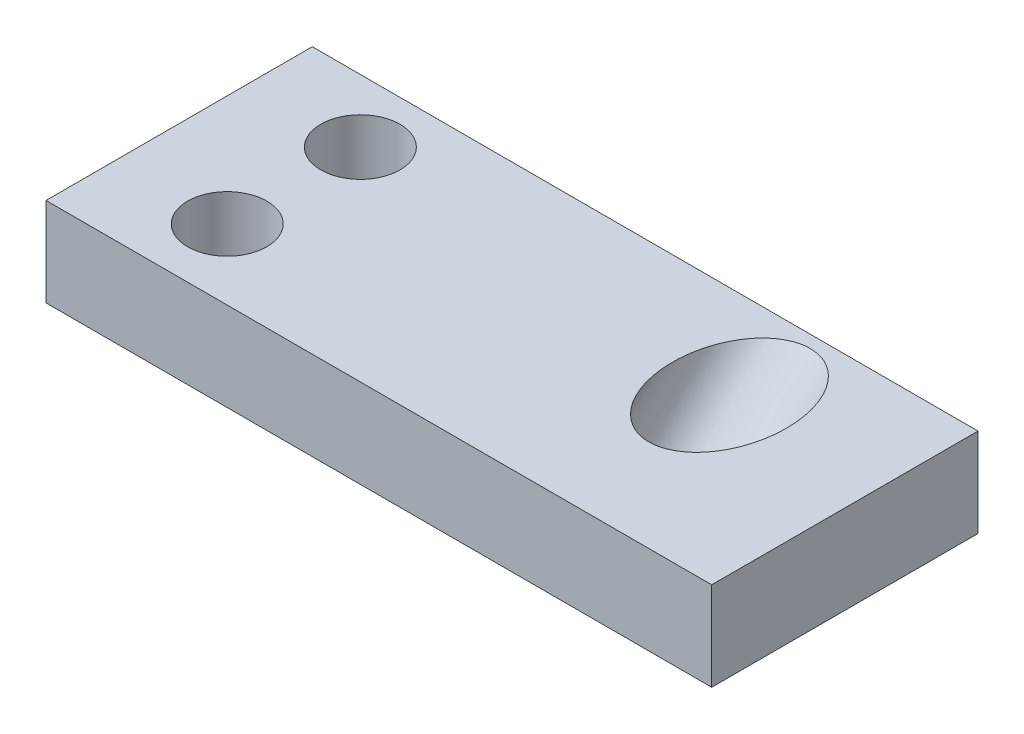
ISO-10303-21;
HEADER;
FILE_DESCRIPTION(('STEP AP214'),'2;1');
FILE_NAME('part.step','',(''),(''),'','','');
FILE_SCHEMA(('AUTOMOTIVE_DESIGN { 1 0 10303 214 1 1 1 1 }'));
ENDSEC;
DATA;
#1=APPLICATION_CONTEXT('core data for automotive mechanical design processes');
#2=APPLICATION_PROTOCOL_DEFINITION('international standard','automotive_design',2000,#1);
#3=PRODUCT_CONTEXT('',#1,'mechanical');
#4=PRODUCT('Part','Part','',(#3));
#5=PRODUCT_RELATED_PRODUCT_CATEGORY('part','',(#4));
#6=PRODUCT_DEFINITION_FORMATION('','',#4);
#7=PRODUCT_DEFINITION_CONTEXT('part definition',#1,'design');
#8=PRODUCT_DEFINITION('design','',#6,#7);
#9=PRODUCT_DEFINITION_SHAPE('','',#8);
#10=(LENGTH_UNIT() NAMED_UNIT(*) SI_UNIT(.MILLI.,.METRE.));
#11=(NAMED_UNIT(*) PLANE_ANGLE_UNIT() SI_UNIT($,.RADIAN.));
#12=(NAMED_UNIT(*) SI_UNIT($,.STERADIAN.) SOLID_ANGLE_UNIT());
#13=UNCERTAINTY_MEASURE_WITH_UNIT(LENGTH_MEASURE(1.E-05),#10,'distance_accuracy_value','');
#14=(GEOMETRIC_REPRESENTATION_CONTEXT(3) GLOBAL_UNCERTAINTY_ASSIGNED_CONTEXT((#13)) GLOBAL_UNIT_ASSIGNED_CONTEXT((#10,
#11,#12)) REPRESENTATION_CONTEXT('',''));
#15=CARTESIAN_POINT('',(0.,0.,0.));
#16=DIRECTION('',(0.,0.,1.));
#17=DIRECTION('',(1.,0.,0.));
#18=AXIS2_PLACEMENT_3D('',#15,#16,#17);
#19=CARTESIAN_POINT('',(0.,4.,0.));
#20=DIRECTION('',(0.,1.,0.));
#21=DIRECTION('',(0.,0.,1.));
#22=AXIS2_PLACEMENT_3D('',#19,#20,#21);
#23=PLANE('',#22);
#24=CARTESIAN_POINT('',(8.00000000000001,4.,-1.79999999999999));
#25=DIRECTION('',(0.,1.,0.));
#26=DIRECTION('',(0.,0.,1.));
#27=AXIS2_PLACEMENT_3D('',#24,#25,#26);
#28=ELLIPSE('',#27,3.6415999231107,2.575);
#29=CARTESIAN_POINT('',(8.00000000000001,4.,1.84159992311071));
#30=VERTEX_POINT('',#29);
#31=EDGE_CURVE('E125',#30,#30,#28,.T.);
#32=ORIENTED_EDGE('',*,*,#31,.F.);
#33=EDGE_LOOP('',(#32));
#34=FACE_BOUND('',#33,.T.);
#35=CARTESIAN_POINT('',(-9.99999999999999,4.,-3.16656909393444));
#36=DIRECTION('',(0.,1.,0.));
#37=DIRECTION('',(0.,0.,1.));
#38=AXIS2_PLACEMENT_3D('',#35,#36,#37);
#39=CIRCLE('',#38,1.78502343525045);
#40=CARTESIAN_POINT('',(-9.99999999999999,4.,-1.381545658684));
#41=VERTEX_POINT('',#40);
#42=EDGE_CURVE('E104',#41,#41,#39,.T.);
#43=ORIENTED_EDGE('',*,*,#42,.F.);
#44=EDGE_LOOP('',(#43));
#45=FACE_BOUND('',#44,.T.);
#46=DIRECTION('',(0.,0.,-1.));
#47=VECTOR('',#46,1.);
#48=CARTESIAN_POINT('',(15.,4.,-5.99999999999999));
#49=LINE('',#48,#47);
#50=CARTESIAN_POINT('',(15.,4.,6.00000000000001));
#51=VERTEX_POINT('',#50);
#52=CARTESIAN_POINT('',(15.,4.,-5.99999999999999));
#53=VERTEX_POINT('',#52);
#54=EDGE_CURVE('E88',#51,#53,#49,.T.);
#55=ORIENTED_EDGE('',*,*,#54,.T.);
#56=DIRECTION('',(-1.,0.,0.));
#57=VECTOR('',#56,1.);
#58=CARTESIAN_POINT('',(-15.,4.,-5.99999999999999));
#59=LINE('',#58,#57);
#60=CARTESIAN_POINT('',(-15.,4.,-5.99999999999999));
#61=VERTEX_POINT('',#60);
#62=EDGE_CURVE('E83',#53,#61,#59,.T.);
#63=ORIENTED_EDGE('',*,*,#62,.T.);
#64=DIRECTION('',(0.,0.,1.));
#65=VECTOR('',#64,1.);
#66=CARTESIAN_POINT('',(-15.,4.,-5.99999999999999));
#67=LINE('',#66,#65);
#68=CARTESIAN_POINT('',(-15.,4.,6.00000000000001));
#69=VERTEX_POINT('',#68);
#70=EDGE_CURVE('E86',#61,#69,#67,.T.);
#71=ORIENTED_EDGE('',*,*,#70,.T.);
#72=DIRECTION('',(1.,0.,0.));
#73=VECTOR('',#72,1.);
#74=CARTESIAN_POINT('',(-15.,4.,6.00000000000001));
#75=LINE('',#74,#73);
#76=EDGE_CURVE('E53',#69,#51,#75,.T.);
#77=ORIENTED_EDGE('',*,*,#76,.T.);
#78=EDGE_LOOP('',(#55,#63,#71,#77));
#79=FACE_BOUND('',#78,.T.);
#80=CARTESIAN_POINT('',(-9.99999999999999,4.,2.83343090606556));
#81=DIRECTION('',(0.,1.,0.));
#82=DIRECTION('',(0.,0.,1.));
#83=AXIS2_PLACEMENT_3D('',#80,#81,#82);
#84=CIRCLE('',#83,1.78502343525045);
#85=CARTESIAN_POINT('',(-9.99999999999999,4.,4.618454341316));
#86=VERTEX_POINT('',#85);
#87=EDGE_CURVE('E119',#86,#86,#84,.T.);
#88=ORIENTED_EDGE('',*,*,#87,.F.);
#89=EDGE_LOOP('',(#88));
#90=FACE_BOUND('',#89,.T.);
#91=ADVANCED_FACE('F35',(#34,#45,#79,#90),#23,.T.);
#92=CARTESIAN_POINT('',(0.,0.,0.));
#93=DIRECTION('',(0.,1.,0.));
#94=DIRECTION('',(0.,0.,1.));
#95=AXIS2_PLACEMENT_3D('',#92,#93,#94);
#96=PLANE('',#95);
#97=CARTESIAN_POINT('',(8.00000000000001,0.,2.19999999999997));
#98=DIRECTION('',(0.,1.,0.));
#99=DIRECTION('',(0.,0.,1.));
#100=AXIS2_PLACEMENT_3D('',#97,#98,#99);
#101=ELLIPSE('',#100,3.6415999231107,2.575);
#102=CARTESIAN_POINT('',(8.00000000000001,0.,5.84159992311067));
#103=VERTEX_POINT('',#102);
#104=EDGE_CURVE('E39',#103,#103,#101,.T.);
#105=ORIENTED_EDGE('',*,*,#104,.T.);
#106=EDGE_LOOP('',(#105));
#107=FACE_BOUND('',#106,.T.);
#108=CARTESIAN_POINT('',(-9.99999999999999,0.,-3.16656909393444));
#109=DIRECTION('',(0.,1.,0.));
#110=DIRECTION('',(0.,0.,1.));
#111=AXIS2_PLACEMENT_3D('',#108,#109,#110);
#112=CIRCLE('',#111,1.78502343525045);
#113=CARTESIAN_POINT('',(-9.99999999999999,0.,-1.381545658684));
#114=VERTEX_POINT('',#113);
#115=EDGE_CURVE('E116',#114,#114,#112,.T.);
#116=ORIENTED_EDGE('',*,*,#115,.T.);
#117=EDGE_LOOP('',(#116));
#118=FACE_BOUND('',#117,.T.);
#119=DIRECTION('',(0.,0.,-1.));
#120=VECTOR('',#119,1.);
#121=CARTESIAN_POINT('',(15.,0.,-5.99999999999999));
#122=LINE('',#121,#120);
#123=CARTESIAN_POINT('',(15.,0.,6.00000000000001));
#124=VERTEX_POINT('',#123);
#125=CARTESIAN_POINT('',(15.,0.,-5.99999999999999));
#126=VERTEX_POINT('',#125);
#127=EDGE_CURVE('E101',#124,#126,#122,.T.);
#128=ORIENTED_EDGE('',*,*,#127,.F.);
#129=DIRECTION('',(1.,0.,0.));
#130=VECTOR('',#129,1.);
#131=CARTESIAN_POINT('',(-15.,0.,6.00000000000001));
#132=LINE('',#131,#130);
#133=CARTESIAN_POINT('',(-15.,0.,6.00000000000001));
#134=VERTEX_POINT('',#133);
#135=EDGE_CURVE('E76',#134,#124,#132,.T.);
#136=ORIENTED_EDGE('',*,*,#135,.F.);
#137=DIRECTION('',(0.,0.,1.));
#138=VECTOR('',#137,1.);
#139=CARTESIAN_POINT('',(-15.,0.,-5.99999999999999));
#140=LINE('',#139,#138);
#141=CARTESIAN_POINT('',(-15.,0.,-5.99999999999999));
#142=VERTEX_POINT('',#141);
#143=EDGE_CURVE('E70',#142,#134,#140,.T.);
#144=ORIENTED_EDGE('',*,*,#143,.F.);
#145=DIRECTION('',(-1.,0.,0.));
#146=VECTOR('',#145,1.);
#147=CARTESIAN_POINT('',(-15.,0.,-5.99999999999999));
#148=LINE('',#147,#146);
#149=EDGE_CURVE('E92',#126,#142,#148,.T.);
#150=ORIENTED_EDGE('',*,*,#149,.F.);
#151=EDGE_LOOP('',(#128,#136,#144,#150));
#152=FACE_BOUND('',#151,.T.);
#153=CARTESIAN_POINT('',(-9.99999999999999,0.,2.83343090606556));
#154=DIRECTION('',(0.,1.,0.));
#155=DIRECTION('',(0.,0.,1.));
#156=AXIS2_PLACEMENT_3D('',#153,#154,#155);
#157=CIRCLE('',#156,1.78502343525045);
#158=CARTESIAN_POINT('',(-9.99999999999999,0.,4.618454341316));
#159=VERTEX_POINT('',#158);
#160=EDGE_CURVE('E122',#159,#159,#157,.T.);
#161=ORIENTED_EDGE('',*,*,#160,.T.);
#162=EDGE_LOOP('',(#161));
#163=FACE_BOUND('',#162,.T.);
#164=ADVANCED_FACE('F112',(#107,#118,#152,#163),#96,.F.);
#165=CARTESIAN_POINT('',(15.,4.,-5.99999999999999));
#166=DIRECTION('',(-1.,0.,0.));
#167=DIRECTION('',(0.,0.,1.));
#168=AXIS2_PLACEMENT_3D('',#165,#166,#167);
#169=PLANE('',#168);
#170=ORIENTED_EDGE('',*,*,#127,.T.);
#171=DIRECTION('',(0.,-1.,0.));
#172=VECTOR('',#171,1.);
#173=CARTESIAN_POINT('',(15.,4.,-5.99999999999999));
#174=LINE('',#173,#172);
#175=EDGE_CURVE('E11',#53,#126,#174,.T.);
#176=ORIENTED_EDGE('',*,*,#175,.F.);
#177=ORIENTED_EDGE('',*,*,#54,.F.);
#178=DIRECTION('',(0.,-1.,0.));
#179=VECTOR('',#178,1.);
#180=CARTESIAN_POINT('',(15.,4.,6.00000000000001));
#181=LINE('',#180,#179);
#182=EDGE_CURVE('E97',#51,#124,#181,.T.);
#183=ORIENTED_EDGE('',*,*,#182,.T.);
#184=EDGE_LOOP('',(#170,#176,#177,#183));
#185=FACE_BOUND('',#184,.T.);
#186=ADVANCED_FACE('F37',(#185),#169,.F.);
#187=CARTESIAN_POINT('',(-15.,4.,-5.99999999999999));
#188=DIRECTION('',(0.,0.,1.));
#189=DIRECTION('',(1.,0.,0.));
#190=AXIS2_PLACEMENT_3D('',#187,#188,#189);
#191=PLANE('',#190);
#192=ORIENTED_EDGE('',*,*,#149,.T.);
#193=DIRECTION('',(0.,-1.,0.));
#194=VECTOR('',#193,1.);
#195=CARTESIAN_POINT('',(-15.,4.,-5.99999999999999));
#196=LINE('',#195,#194);
#197=EDGE_CURVE('E45',#61,#142,#196,.T.);
#198=ORIENTED_EDGE('',*,*,#197,.F.);
#199=ORIENTED_EDGE('',*,*,#62,.F.);
#200=ORIENTED_EDGE('',*,*,#175,.T.);
#201=EDGE_LOOP('',(#192,#198,#199,#200));
#202=FACE_BOUND('',#201,.T.);
#203=ADVANCED_FACE('F91',(#202),#191,.F.);
#204=CARTESIAN_POINT('',(-15.,4.,-5.99999999999999));
#205=DIRECTION('',(1.,0.,0.));
#206=DIRECTION('',(0.,0.,-1.));
#207=AXIS2_PLACEMENT_3D('',#204,#205,#206);
#208=PLANE('',#207);
#209=ORIENTED_EDGE('',*,*,#143,.T.);
#210=DIRECTION('',(0.,-1.,0.));
#211=VECTOR('',#210,1.);
#212=CARTESIAN_POINT('',(-15.,4.,6.00000000000001));
#213=LINE('',#212,#211);
#214=EDGE_CURVE('E93',#69,#134,#213,.T.);
#215=ORIENTED_EDGE('',*,*,#214,.F.);
#216=ORIENTED_EDGE('',*,*,#70,.F.);
#217=ORIENTED_EDGE('',*,*,#197,.T.);
#218=EDGE_LOOP('',(#209,#215,#216,#217));
#219=FACE_BOUND('',#218,.T.);
#220=ADVANCED_FACE('F95',(#219),#208,.F.);
#221=CARTESIAN_POINT('',(-15.,4.,6.00000000000001));
#222=DIRECTION('',(0.,0.,-1.));
#223=DIRECTION('',(-1.,0.,0.));
#224=AXIS2_PLACEMENT_3D('',#221,#222,#223);
#225=PLANE('',#224);
#226=ORIENTED_EDGE('',*,*,#135,.T.);
#227=ORIENTED_EDGE('',*,*,#182,.F.);
#228=ORIENTED_EDGE('',*,*,#76,.F.);
#229=ORIENTED_EDGE('',*,*,#214,.T.);
#230=EDGE_LOOP('',(#226,#227,#228,#229));
#231=FACE_BOUND('',#230,.T.);
#232=ADVANCED_FACE('F109',(#231),#225,.F.);
#233=CARTESIAN_POINT('',(-9.99999999999999,4.,-3.16656909393444));
#234=DIRECTION('',(0.,-1.,0.));
#235=DIRECTION('',(0.,0.,-1.));
#236=AXIS2_PLACEMENT_3D('',#233,#234,#235);
#237=CYLINDRICAL_SURFACE('',#236,1.78502343525045);
#238=ORIENTED_EDGE('',*,*,#42,.T.);
#239=EDGE_LOOP('',(#238));
#240=FACE_BOUND('',#239,.T.);
#241=ORIENTED_EDGE('',*,*,#115,.F.);
#242=EDGE_LOOP('',(#241));
#243=FACE_BOUND('',#242,.T.);
#244=ADVANCED_FACE('F143',(#240,#243),#237,.F.);
#245=CARTESIAN_POINT('',(-9.99999999999999,4.,2.83343090606556));
#246=DIRECTION('',(0.,-1.,0.));
#247=DIRECTION('',(0.,0.,-1.));
#248=AXIS2_PLACEMENT_3D('',#245,#246,#247);
#249=CYLINDRICAL_SURFACE('',#248,1.78502343525045);
#250=ORIENTED_EDGE('',*,*,#87,.T.);
#251=EDGE_LOOP('',(#250));
#252=FACE_BOUND('',#251,.T.);
#253=ORIENTED_EDGE('',*,*,#160,.F.);
#254=EDGE_LOOP('',(#253));
#255=FACE_BOUND('',#254,.T.);
#256=ADVANCED_FACE('F138',(#252,#255),#249,.F.);
#257=CARTESIAN_POINT('',(8.00000000000001,21.6776695296638,-19.4776695296636));
#258=DIRECTION('',(0.,-0.707106781186551,0.707106781186544));
#259=DIRECTION('',(0.,-0.707106781186544,-0.707106781186551));
#260=AXIS2_PLACEMENT_3D('',#257,#258,#259);
#261=CYLINDRICAL_SURFACE('',#260,2.575);
#262=ORIENTED_EDGE('',*,*,#31,.T.);
#263=EDGE_LOOP('',(#262));
#264=FACE_BOUND('',#263,.T.);
#265=ORIENTED_EDGE('',*,*,#104,.F.);
#266=EDGE_LOOP('',(#265));
#267=FACE_BOUND('',#266,.T.);
#268=ADVANCED_FACE('F136',(#264,#267),#261,.F.);
#269=CLOSED_SHELL('',(#91,#164,#186,#203,#220,#232,#244,#256,#268));
#270=MANIFOLD_SOLID_BREP('B2',#269);
#271=ADVANCED_BREP_SHAPE_REPRESENTATION('',(#18,#270),#14);
#272=SHAPE_DEFINITION_REPRESENTATION(#9,#271);
ENDSEC;
END-ISO-10303-21;
